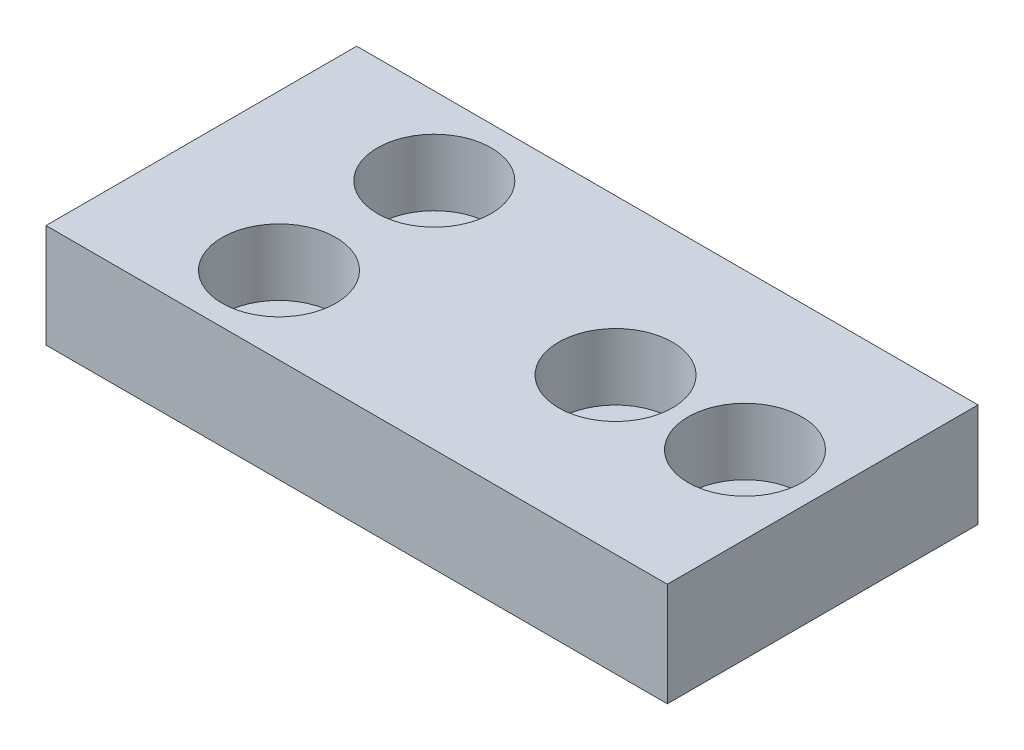
ISO-10303-21;
HEADER;
FILE_DESCRIPTION(('STEP AP214'),'2;1');
FILE_NAME('part.step','',(''),(''),'','','');
FILE_SCHEMA(('AUTOMOTIVE_DESIGN { 1 0 10303 214 1 1 1 1 }'));
ENDSEC;
DATA;
#1=APPLICATION_CONTEXT('core data for automotive mechanical design processes');
#2=APPLICATION_PROTOCOL_DEFINITION('international standard','automotive_design',2000,#1);
#3=PRODUCT_CONTEXT('',#1,'mechanical');
#4=PRODUCT('Part','Part','',(#3));
#5=PRODUCT_RELATED_PRODUCT_CATEGORY('part','',(#4));
#6=PRODUCT_DEFINITION_FORMATION('','',#4);
#7=PRODUCT_DEFINITION_CONTEXT('part definition',#1,'design');
#8=PRODUCT_DEFINITION('design','',#6,#7);
#9=PRODUCT_DEFINITION_SHAPE('','',#8);
#10=(LENGTH_UNIT() NAMED_UNIT(*) SI_UNIT(.MILLI.,.METRE.));
#11=(NAMED_UNIT(*) PLANE_ANGLE_UNIT() SI_UNIT($,.RADIAN.));
#12=(NAMED_UNIT(*) SI_UNIT($,.STERADIAN.) SOLID_ANGLE_UNIT());
#13=UNCERTAINTY_MEASURE_WITH_UNIT(LENGTH_MEASURE(1.E-05),#10,'distance_accuracy_value','');
#14=(GEOMETRIC_REPRESENTATION_CONTEXT(3) GLOBAL_UNCERTAINTY_ASSIGNED_CONTEXT((#13)) GLOBAL_UNIT_ASSIGNED_CONTEXT((#10,
#11,#12)) REPRESENTATION_CONTEXT('',''));
#15=CARTESIAN_POINT('',(0.,0.,0.));
#16=DIRECTION('',(0.,0.,1.));
#17=DIRECTION('',(1.,0.,0.));
#18=AXIS2_PLACEMENT_3D('',#15,#16,#17);
#19=CARTESIAN_POINT('',(30.,5.,-15.));
#20=DIRECTION('',(-1.,0.,0.));
#21=DIRECTION('',(0.,0.,1.));
#22=AXIS2_PLACEMENT_3D('',#19,#20,#21);
#23=PLANE('',#22);
#24=DIRECTION('',(0.,0.,-1.));
#25=VECTOR('',#24,1.);
#26=CARTESIAN_POINT('',(30.,-5.,-15.));
#27=LINE('',#26,#25);
#28=CARTESIAN_POINT('',(30.,-5.,15.));
#29=VERTEX_POINT('',#28);
#30=CARTESIAN_POINT('',(30.,-5.,-15.));
#31=VERTEX_POINT('',#30);
#32=EDGE_CURVE('E111',#29,#31,#27,.T.);
#33=ORIENTED_EDGE('',*,*,#32,.T.);
#34=DIRECTION('',(0.,-1.,0.));
#35=VECTOR('',#34,1.);
#36=CARTESIAN_POINT('',(30.,5.,-15.));
#37=LINE('',#36,#35);
#38=CARTESIAN_POINT('',(30.,5.,-15.));
#39=VERTEX_POINT('',#38);
#40=EDGE_CURVE('E11',#39,#31,#37,.T.);
#41=ORIENTED_EDGE('',*,*,#40,.F.);
#42=DIRECTION('',(0.,0.,-1.));
#43=VECTOR('',#42,1.);
#44=CARTESIAN_POINT('',(30.,5.,-15.));
#45=LINE('',#44,#43);
#46=CARTESIAN_POINT('',(30.,5.,15.));
#47=VERTEX_POINT('',#46);
#48=EDGE_CURVE('E95',#47,#39,#45,.T.);
#49=ORIENTED_EDGE('',*,*,#48,.F.);
#50=DIRECTION('',(0.,-1.,0.));
#51=VECTOR('',#50,1.);
#52=CARTESIAN_POINT('',(30.,5.,15.));
#53=LINE('',#52,#51);
#54=EDGE_CURVE('E107',#47,#29,#53,.T.);
#55=ORIENTED_EDGE('',*,*,#54,.T.);
#56=EDGE_LOOP('',(#33,#41,#49,#55));
#57=FACE_BOUND('',#56,.T.);
#58=ADVANCED_FACE('F43',(#57),#23,.F.);
#59=CARTESIAN_POINT('',(-30.,5.,-15.));
#60=DIRECTION('',(0.,0.,1.));
#61=DIRECTION('',(1.,0.,0.));
#62=AXIS2_PLACEMENT_3D('',#59,#60,#61);
#63=PLANE('',#62);
#64=DIRECTION('',(-1.,0.,0.));
#65=VECTOR('',#64,1.);
#66=CARTESIAN_POINT('',(-30.,-5.,-15.));
#67=LINE('',#66,#65);
#68=CARTESIAN_POINT('',(-30.,-5.,-15.));
#69=VERTEX_POINT('',#68);
#70=EDGE_CURVE('E100',#31,#69,#67,.T.);
#71=ORIENTED_EDGE('',*,*,#70,.T.);
#72=DIRECTION('',(0.,-1.,0.));
#73=VECTOR('',#72,1.);
#74=CARTESIAN_POINT('',(-30.,5.,-15.));
#75=LINE('',#74,#73);
#76=CARTESIAN_POINT('',(-30.,5.,-15.));
#77=VERTEX_POINT('',#76);
#78=EDGE_CURVE('E52',#77,#69,#75,.T.);
#79=ORIENTED_EDGE('',*,*,#78,.F.);
#80=DIRECTION('',(-1.,0.,0.));
#81=VECTOR('',#80,1.);
#82=CARTESIAN_POINT('',(-30.,5.,-15.));
#83=LINE('',#82,#81);
#84=EDGE_CURVE('E90',#39,#77,#83,.T.);
#85=ORIENTED_EDGE('',*,*,#84,.F.);
#86=ORIENTED_EDGE('',*,*,#40,.T.);
#87=EDGE_LOOP('',(#71,#79,#85,#86));
#88=FACE_BOUND('',#87,.T.);
#89=ADVANCED_FACE('F99',(#88),#63,.F.);
#90=CARTESIAN_POINT('',(-30.,5.,-15.));
#91=DIRECTION('',(1.,0.,0.));
#92=DIRECTION('',(0.,0.,-1.));
#93=AXIS2_PLACEMENT_3D('',#90,#91,#92);
#94=PLANE('',#93);
#95=DIRECTION('',(0.,0.,1.));
#96=VECTOR('',#95,1.);
#97=CARTESIAN_POINT('',(-30.,-5.,-15.));
#98=LINE('',#97,#96);
#99=CARTESIAN_POINT('',(-30.,-5.,15.));
#100=VERTEX_POINT('',#99);
#101=EDGE_CURVE('E77',#69,#100,#98,.T.);
#102=ORIENTED_EDGE('',*,*,#101,.T.);
#103=DIRECTION('',(0.,-1.,0.));
#104=VECTOR('',#103,1.);
#105=CARTESIAN_POINT('',(-30.,5.,15.));
#106=LINE('',#105,#104);
#107=CARTESIAN_POINT('',(-30.,5.,15.));
#108=VERTEX_POINT('',#107);
#109=EDGE_CURVE('E102',#108,#100,#106,.T.);
#110=ORIENTED_EDGE('',*,*,#109,.F.);
#111=DIRECTION('',(0.,0.,1.));
#112=VECTOR('',#111,1.);
#113=CARTESIAN_POINT('',(-30.,5.,-15.));
#114=LINE('',#113,#112);
#115=EDGE_CURVE('E93',#77,#108,#114,.T.);
#116=ORIENTED_EDGE('',*,*,#115,.F.);
#117=ORIENTED_EDGE('',*,*,#78,.T.);
#118=EDGE_LOOP('',(#102,#110,#116,#117));
#119=FACE_BOUND('',#118,.T.);
#120=ADVANCED_FACE('F103',(#119),#94,.F.);
#121=CARTESIAN_POINT('',(-30.,5.,15.));
#122=DIRECTION('',(0.,0.,-1.));
#123=DIRECTION('',(-1.,0.,0.));
#124=AXIS2_PLACEMENT_3D('',#121,#122,#123);
#125=PLANE('',#124);
#126=DIRECTION('',(1.,0.,0.));
#127=VECTOR('',#126,1.);
#128=CARTESIAN_POINT('',(-30.,-5.,15.));
#129=LINE('',#128,#127);
#130=EDGE_CURVE('E83',#100,#29,#129,.T.);
#131=ORIENTED_EDGE('',*,*,#130,.T.);
#132=ORIENTED_EDGE('',*,*,#54,.F.);
#133=DIRECTION('',(1.,0.,0.));
#134=VECTOR('',#133,1.);
#135=CARTESIAN_POINT('',(-30.,5.,15.));
#136=LINE('',#135,#134);
#137=EDGE_CURVE('E60',#108,#47,#136,.T.);
#138=ORIENTED_EDGE('',*,*,#137,.F.);
#139=ORIENTED_EDGE('',*,*,#109,.T.);
#140=EDGE_LOOP('',(#131,#132,#138,#139));
#141=FACE_BOUND('',#140,.T.);
#142=ADVANCED_FACE('F125',(#141),#125,.F.);
#143=CARTESIAN_POINT('',(0.,5.,0.));
#144=DIRECTION('',(0.,1.,0.));
#145=DIRECTION('',(0.,0.,1.));
#146=AXIS2_PLACEMENT_3D('',#143,#144,#145);
#147=PLANE('',#146);
#148=CARTESIAN_POINT('',(9.99999999999999,5.,0.));
#149=DIRECTION('',(0.,1.,0.));
#150=DIRECTION('',(0.,0.,1.));
#151=AXIS2_PLACEMENT_3D('',#148,#149,#150);
#152=CIRCLE('',#151,5.49999999999999);
#153=CARTESIAN_POINT('',(9.99999999999999,5.,5.49999999999999));
#154=VERTEX_POINT('',#153);
#155=EDGE_CURVE('E191',#154,#154,#152,.T.);
#156=ORIENTED_EDGE('',*,*,#155,.F.);
#157=EDGE_LOOP('',(#156));
#158=FACE_BOUND('',#157,.T.);
#159=CARTESIAN_POINT('',(22.5,5.,0.));
#160=DIRECTION('',(0.,1.,0.));
#161=DIRECTION('',(0.,0.,1.));
#162=AXIS2_PLACEMENT_3D('',#159,#160,#161);
#163=CIRCLE('',#162,5.49999999999999);
#164=CARTESIAN_POINT('',(22.5,5.,5.49999999999999));
#165=VERTEX_POINT('',#164);
#166=EDGE_CURVE('E175',#165,#165,#163,.T.);
#167=ORIENTED_EDGE('',*,*,#166,.F.);
#168=EDGE_LOOP('',(#167));
#169=FACE_BOUND('',#168,.T.);
#170=CARTESIAN_POINT('',(-15.,5.,-7.5));
#171=DIRECTION('',(0.,1.,0.));
#172=DIRECTION('',(0.,0.,1.));
#173=AXIS2_PLACEMENT_3D('',#170,#171,#172);
#174=CIRCLE('',#173,5.5);
#175=CARTESIAN_POINT('',(-15.,5.,-2.));
#176=VERTEX_POINT('',#175);
#177=EDGE_CURVE('E159',#176,#176,#174,.T.);
#178=ORIENTED_EDGE('',*,*,#177,.F.);
#179=EDGE_LOOP('',(#178));
#180=FACE_BOUND('',#179,.T.);
#181=CARTESIAN_POINT('',(-15.,5.,7.5));
#182=DIRECTION('',(0.,1.,0.));
#183=DIRECTION('',(0.,0.,1.));
#184=AXIS2_PLACEMENT_3D('',#181,#182,#183);
#185=CIRCLE('',#184,5.5);
#186=CARTESIAN_POINT('',(-15.,5.,13.));
#187=VERTEX_POINT('',#186);
#188=EDGE_CURVE('E143',#187,#187,#185,.T.);
#189=ORIENTED_EDGE('',*,*,#188,.F.);
#190=EDGE_LOOP('',(#189));
#191=FACE_BOUND('',#190,.T.);
#192=ORIENTED_EDGE('',*,*,#48,.T.);
#193=ORIENTED_EDGE('',*,*,#84,.T.);
#194=ORIENTED_EDGE('',*,*,#115,.T.);
#195=ORIENTED_EDGE('',*,*,#137,.T.);
#196=EDGE_LOOP('',(#192,#193,#194,#195));
#197=FACE_BOUND('',#196,.T.);
#198=ADVANCED_FACE('F91',(#158,#169,#180,#191,#197),#147,.T.);
#199=CARTESIAN_POINT('',(0.,-5.,0.));
#200=DIRECTION('',(0.,1.,0.));
#201=DIRECTION('',(0.,0.,1.));
#202=AXIS2_PLACEMENT_3D('',#199,#200,#201);
#203=PLANE('',#202);
#204=CARTESIAN_POINT('',(9.99999999999999,-5.,0.));
#205=DIRECTION('',(0.,1.,0.));
#206=DIRECTION('',(0.,0.,1.));
#207=AXIS2_PLACEMENT_3D('',#204,#205,#206);
#208=CIRCLE('',#207,3.3);
#209=CARTESIAN_POINT('',(9.99999999999999,-5.,3.3));
#210=VERTEX_POINT('',#209);
#211=EDGE_CURVE('E179',#210,#210,#208,.T.);
#212=ORIENTED_EDGE('',*,*,#211,.T.);
#213=EDGE_LOOP('',(#212));
#214=FACE_BOUND('',#213,.T.);
#215=CARTESIAN_POINT('',(22.5,-5.,0.));
#216=DIRECTION('',(0.,1.,0.));
#217=DIRECTION('',(0.,0.,1.));
#218=AXIS2_PLACEMENT_3D('',#215,#216,#217);
#219=CIRCLE('',#218,3.3);
#220=CARTESIAN_POINT('',(22.5,-5.,3.3));
#221=VERTEX_POINT('',#220);
#222=EDGE_CURVE('E163',#221,#221,#219,.T.);
#223=ORIENTED_EDGE('',*,*,#222,.T.);
#224=EDGE_LOOP('',(#223));
#225=FACE_BOUND('',#224,.T.);
#226=CARTESIAN_POINT('',(-15.,-5.,-7.5));
#227=DIRECTION('',(0.,1.,0.));
#228=DIRECTION('',(0.,0.,1.));
#229=AXIS2_PLACEMENT_3D('',#226,#227,#228);
#230=CIRCLE('',#229,3.3);
#231=CARTESIAN_POINT('',(-15.,-5.,-4.2));
#232=VERTEX_POINT('',#231);
#233=EDGE_CURVE('E147',#232,#232,#230,.T.);
#234=ORIENTED_EDGE('',*,*,#233,.T.);
#235=EDGE_LOOP('',(#234));
#236=FACE_BOUND('',#235,.T.);
#237=CARTESIAN_POINT('',(-15.,-5.,7.5));
#238=DIRECTION('',(0.,1.,0.));
#239=DIRECTION('',(0.,0.,1.));
#240=AXIS2_PLACEMENT_3D('',#237,#238,#239);
#241=CIRCLE('',#240,3.3);
#242=CARTESIAN_POINT('',(-15.,-5.,10.8));
#243=VERTEX_POINT('',#242);
#244=EDGE_CURVE('E115',#243,#243,#241,.T.);
#245=ORIENTED_EDGE('',*,*,#244,.T.);
#246=EDGE_LOOP('',(#245));
#247=FACE_BOUND('',#246,.T.);
#248=ORIENTED_EDGE('',*,*,#32,.F.);
#249=ORIENTED_EDGE('',*,*,#130,.F.);
#250=ORIENTED_EDGE('',*,*,#101,.F.);
#251=ORIENTED_EDGE('',*,*,#70,.F.);
#252=EDGE_LOOP('',(#248,#249,#250,#251));
#253=FACE_BOUND('',#252,.T.);
#254=ADVANCED_FACE('F128',(#214,#225,#236,#247,#253),#203,.F.);
#255=CARTESIAN_POINT('',(-15.,5.,7.5));
#256=DIRECTION('',(0.,1.,0.));
#257=DIRECTION('',(0.,0.,1.));
#258=AXIS2_PLACEMENT_3D('',#255,#256,#257);
#259=CYLINDRICAL_SURFACE('',#258,3.3);
#260=ORIENTED_EDGE('',*,*,#244,.F.);
#261=EDGE_LOOP('',(#260));
#262=FACE_BOUND('',#261,.T.);
#263=CARTESIAN_POINT('',(-15.,-1.4,7.5));
#264=DIRECTION('',(0.,1.,0.));
#265=DIRECTION('',(0.,0.,1.));
#266=AXIS2_PLACEMENT_3D('',#263,#264,#265);
#267=CIRCLE('',#266,3.3);
#268=CARTESIAN_POINT('',(-15.,-1.4,10.8));
#269=VERTEX_POINT('',#268);
#270=EDGE_CURVE('E135',#269,#269,#267,.T.);
#271=ORIENTED_EDGE('',*,*,#270,.T.);
#272=EDGE_LOOP('',(#271));
#273=FACE_BOUND('',#272,.T.);
#274=ADVANCED_FACE('F220',(#262,#273),#259,.F.);
#275=CARTESIAN_POINT('',(-11.7,-1.4,7.5));
#276=DIRECTION('',(0.,-1.,0.));
#277=DIRECTION('',(0.,0.,-1.));
#278=AXIS2_PLACEMENT_3D('',#275,#276,#277);
#279=PLANE('',#278);
#280=ORIENTED_EDGE('',*,*,#270,.F.);
#281=EDGE_LOOP('',(#280));
#282=FACE_BOUND('',#281,.T.);
#283=CARTESIAN_POINT('',(-15.,-1.4,7.5));
#284=DIRECTION('',(0.,1.,0.));
#285=DIRECTION('',(0.,0.,1.));
#286=AXIS2_PLACEMENT_3D('',#283,#284,#285);
#287=CIRCLE('',#286,5.5);
#288=CARTESIAN_POINT('',(-15.,-1.4,13.));
#289=VERTEX_POINT('',#288);
#290=EDGE_CURVE('E139',#289,#289,#287,.T.);
#291=ORIENTED_EDGE('',*,*,#290,.T.);
#292=EDGE_LOOP('',(#291));
#293=FACE_BOUND('',#292,.T.);
#294=ADVANCED_FACE('F210',(#282,#293),#279,.F.);
#295=CARTESIAN_POINT('',(-15.,5.,7.5));
#296=DIRECTION('',(0.,1.,0.));
#297=DIRECTION('',(0.,0.,1.));
#298=AXIS2_PLACEMENT_3D('',#295,#296,#297);
#299=CYLINDRICAL_SURFACE('',#298,5.5);
#300=ORIENTED_EDGE('',*,*,#290,.F.);
#301=EDGE_LOOP('',(#300));
#302=FACE_BOUND('',#301,.T.);
#303=ORIENTED_EDGE('',*,*,#188,.T.);
#304=EDGE_LOOP('',(#303));
#305=FACE_BOUND('',#304,.T.);
#306=ADVANCED_FACE('F207',(#302,#305),#299,.F.);
#307=CARTESIAN_POINT('',(-15.,5.,-7.5));
#308=DIRECTION('',(0.,1.,0.));
#309=DIRECTION('',(0.,0.,1.));
#310=AXIS2_PLACEMENT_3D('',#307,#308,#309);
#311=CYLINDRICAL_SURFACE('',#310,3.3);
#312=ORIENTED_EDGE('',*,*,#233,.F.);
#313=EDGE_LOOP('',(#312));
#314=FACE_BOUND('',#313,.T.);
#315=CARTESIAN_POINT('',(-15.,-1.4,-7.5));
#316=DIRECTION('',(0.,1.,0.));
#317=DIRECTION('',(0.,0.,1.));
#318=AXIS2_PLACEMENT_3D('',#315,#316,#317);
#319=CIRCLE('',#318,3.3);
#320=CARTESIAN_POINT('',(-15.,-1.4,-4.2));
#321=VERTEX_POINT('',#320);
#322=EDGE_CURVE('E151',#321,#321,#319,.T.);
#323=ORIENTED_EDGE('',*,*,#322,.T.);
#324=EDGE_LOOP('',(#323));
#325=FACE_BOUND('',#324,.T.);
#326=ADVANCED_FACE('F209',(#314,#325),#311,.F.);
#327=CARTESIAN_POINT('',(-11.7,-1.4,-7.5));
#328=DIRECTION('',(0.,-1.,0.));
#329=DIRECTION('',(0.,0.,-1.));
#330=AXIS2_PLACEMENT_3D('',#327,#328,#329);
#331=PLANE('',#330);
#332=ORIENTED_EDGE('',*,*,#322,.F.);
#333=EDGE_LOOP('',(#332));
#334=FACE_BOUND('',#333,.T.);
#335=CARTESIAN_POINT('',(-15.,-1.4,-7.5));
#336=DIRECTION('',(0.,1.,0.));
#337=DIRECTION('',(0.,0.,1.));
#338=AXIS2_PLACEMENT_3D('',#335,#336,#337);
#339=CIRCLE('',#338,5.5);
#340=CARTESIAN_POINT('',(-15.,-1.4,-2.));
#341=VERTEX_POINT('',#340);
#342=EDGE_CURVE('E155',#341,#341,#339,.T.);
#343=ORIENTED_EDGE('',*,*,#342,.T.);
#344=EDGE_LOOP('',(#343));
#345=FACE_BOUND('',#344,.T.);
#346=ADVANCED_FACE('F217',(#334,#345),#331,.F.);
#347=CARTESIAN_POINT('',(-15.,5.,-7.5));
#348=DIRECTION('',(0.,1.,0.));
#349=DIRECTION('',(0.,0.,1.));
#350=AXIS2_PLACEMENT_3D('',#347,#348,#349);
#351=CYLINDRICAL_SURFACE('',#350,5.5);
#352=ORIENTED_EDGE('',*,*,#342,.F.);
#353=EDGE_LOOP('',(#352));
#354=FACE_BOUND('',#353,.T.);
#355=ORIENTED_EDGE('',*,*,#177,.T.);
#356=EDGE_LOOP('',(#355));
#357=FACE_BOUND('',#356,.T.);
#358=ADVANCED_FACE('F276',(#354,#357),#351,.F.);
#359=CARTESIAN_POINT('',(22.5,5.,0.));
#360=DIRECTION('',(0.,1.,0.));
#361=DIRECTION('',(0.,0.,1.));
#362=AXIS2_PLACEMENT_3D('',#359,#360,#361);
#363=CYLINDRICAL_SURFACE('',#362,3.3);
#364=ORIENTED_EDGE('',*,*,#222,.F.);
#365=EDGE_LOOP('',(#364));
#366=FACE_BOUND('',#365,.T.);
#367=CARTESIAN_POINT('',(22.5,-1.4,0.));
#368=DIRECTION('',(0.,1.,0.));
#369=DIRECTION('',(0.,0.,1.));
#370=AXIS2_PLACEMENT_3D('',#367,#368,#369);
#371=CIRCLE('',#370,3.30000000000001);
#372=CARTESIAN_POINT('',(22.5,-1.4,3.30000000000001));
#373=VERTEX_POINT('',#372);
#374=EDGE_CURVE('E167',#373,#373,#371,.T.);
#375=ORIENTED_EDGE('',*,*,#374,.T.);
#376=EDGE_LOOP('',(#375));
#377=FACE_BOUND('',#376,.T.);
#378=ADVANCED_FACE('F287',(#366,#377),#363,.F.);
#379=CARTESIAN_POINT('',(25.8,-1.4,0.));
#380=DIRECTION('',(0.,-1.,0.));
#381=DIRECTION('',(0.,0.,-1.));
#382=AXIS2_PLACEMENT_3D('',#379,#380,#381);
#383=PLANE('',#382);
#384=ORIENTED_EDGE('',*,*,#374,.F.);
#385=EDGE_LOOP('',(#384));
#386=FACE_BOUND('',#385,.T.);
#387=CARTESIAN_POINT('',(22.5,-1.4,0.));
#388=DIRECTION('',(0.,1.,0.));
#389=DIRECTION('',(0.,0.,1.));
#390=AXIS2_PLACEMENT_3D('',#387,#388,#389);
#391=CIRCLE('',#390,5.49999999999999);
#392=CARTESIAN_POINT('',(22.5,-1.4,5.49999999999999));
#393=VERTEX_POINT('',#392);
#394=EDGE_CURVE('E171',#393,#393,#391,.T.);
#395=ORIENTED_EDGE('',*,*,#394,.T.);
#396=EDGE_LOOP('',(#395));
#397=FACE_BOUND('',#396,.T.);
#398=ADVANCED_FACE('F311',(#386,#397),#383,.F.);
#399=CARTESIAN_POINT('',(22.5,5.,0.));
#400=DIRECTION('',(0.,1.,0.));
#401=DIRECTION('',(0.,0.,1.));
#402=AXIS2_PLACEMENT_3D('',#399,#400,#401);
#403=CYLINDRICAL_SURFACE('',#402,5.49999999999999);
#404=ORIENTED_EDGE('',*,*,#394,.F.);
#405=EDGE_LOOP('',(#404));
#406=FACE_BOUND('',#405,.T.);
#407=ORIENTED_EDGE('',*,*,#166,.T.);
#408=EDGE_LOOP('',(#407));
#409=FACE_BOUND('',#408,.T.);
#410=ADVANCED_FACE('F322',(#406,#409),#403,.F.);
#411=CARTESIAN_POINT('',(9.99999999999999,5.,0.));
#412=DIRECTION('',(0.,1.,0.));
#413=DIRECTION('',(0.,0.,1.));
#414=AXIS2_PLACEMENT_3D('',#411,#412,#413);
#415=CYLINDRICAL_SURFACE('',#414,3.3);
#416=ORIENTED_EDGE('',*,*,#211,.F.);
#417=EDGE_LOOP('',(#416));
#418=FACE_BOUND('',#417,.T.);
#419=CARTESIAN_POINT('',(9.99999999999999,-1.4,0.));
#420=DIRECTION('',(0.,1.,0.));
#421=DIRECTION('',(0.,0.,1.));
#422=AXIS2_PLACEMENT_3D('',#419,#420,#421);
#423=CIRCLE('',#422,3.30000000000001);
#424=CARTESIAN_POINT('',(9.99999999999999,-1.4,3.30000000000001));
#425=VERTEX_POINT('',#424);
#426=EDGE_CURVE('E183',#425,#425,#423,.T.);
#427=ORIENTED_EDGE('',*,*,#426,.T.);
#428=EDGE_LOOP('',(#427));
#429=FACE_BOUND('',#428,.T.);
#430=ADVANCED_FACE('F333',(#418,#429),#415,.F.);
#431=CARTESIAN_POINT('',(13.3,-1.4,0.));
#432=DIRECTION('',(0.,-1.,0.));
#433=DIRECTION('',(0.,0.,-1.));
#434=AXIS2_PLACEMENT_3D('',#431,#432,#433);
#435=PLANE('',#434);
#436=ORIENTED_EDGE('',*,*,#426,.F.);
#437=EDGE_LOOP('',(#436));
#438=FACE_BOUND('',#437,.T.);
#439=CARTESIAN_POINT('',(9.99999999999999,-1.4,0.));
#440=DIRECTION('',(0.,1.,0.));
#441=DIRECTION('',(0.,0.,1.));
#442=AXIS2_PLACEMENT_3D('',#439,#440,#441);
#443=CIRCLE('',#442,5.49999999999999);
#444=CARTESIAN_POINT('',(9.99999999999999,-1.4,5.49999999999999));
#445=VERTEX_POINT('',#444);
#446=EDGE_CURVE('E187',#445,#445,#443,.T.);
#447=ORIENTED_EDGE('',*,*,#446,.T.);
#448=EDGE_LOOP('',(#447));
#449=FACE_BOUND('',#448,.T.);
#450=ADVANCED_FACE('F344',(#438,#449),#435,.F.);
#451=CARTESIAN_POINT('',(9.99999999999999,5.,0.));
#452=DIRECTION('',(0.,1.,0.));
#453=DIRECTION('',(0.,0.,1.));
#454=AXIS2_PLACEMENT_3D('',#451,#452,#453);
#455=CYLINDRICAL_SURFACE('',#454,5.49999999999999);
#456=ORIENTED_EDGE('',*,*,#446,.F.);
#457=EDGE_LOOP('',(#456));
#458=FACE_BOUND('',#457,.T.);
#459=ORIENTED_EDGE('',*,*,#155,.T.);
#460=EDGE_LOOP('',(#459));
#461=FACE_BOUND('',#460,.T.);
#462=ADVANCED_FACE('F196',(#458,#461),#455,.F.);
#463=CLOSED_SHELL('',(#58,#89,#120,#142,#198,#254,#274,#294,#306,#326,#346,#358,#378,#398,#410,
#430,#450,#462));
#464=MANIFOLD_SOLID_BREP('B2',#463);
#465=ADVANCED_BREP_SHAPE_REPRESENTATION('',(#18,#464),#14);
#466=SHAPE_DEFINITION_REPRESENTATION(#9,#465);
ENDSEC;
END-ISO-10303-21;
